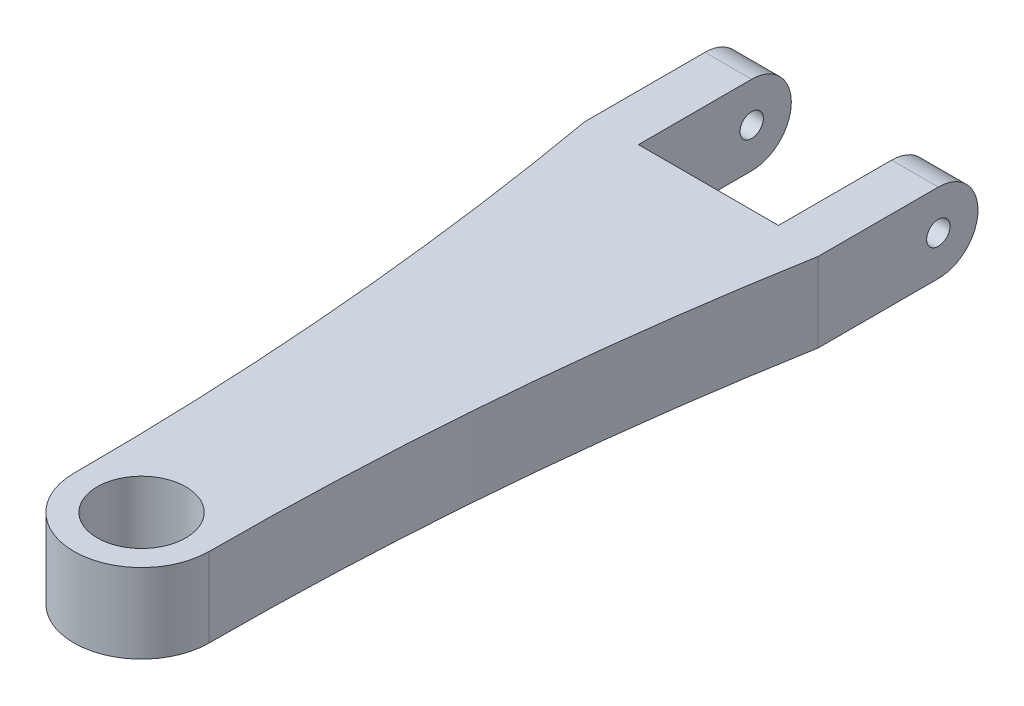
ISO-10303-21;
HEADER;
FILE_DESCRIPTION(('STEP AP214'),'2;1');
FILE_NAME('part.step','',(''),(''),'','','');
FILE_SCHEMA(('AUTOMOTIVE_DESIGN { 1 0 10303 214 1 1 1 1 }'));
ENDSEC;
DATA;
#1=APPLICATION_CONTEXT('core data for automotive mechanical design processes');
#2=APPLICATION_PROTOCOL_DEFINITION('international standard','automotive_design',2000,#1);
#3=PRODUCT_CONTEXT('',#1,'mechanical');
#4=PRODUCT('Part','Part','',(#3));
#5=PRODUCT_RELATED_PRODUCT_CATEGORY('part','',(#4));
#6=PRODUCT_DEFINITION_FORMATION('','',#4);
#7=PRODUCT_DEFINITION_CONTEXT('part definition',#1,'design');
#8=PRODUCT_DEFINITION('design','',#6,#7);
#9=PRODUCT_DEFINITION_SHAPE('','',#8);
#10=(LENGTH_UNIT() NAMED_UNIT(*) SI_UNIT(.MILLI.,.METRE.));
#11=(NAMED_UNIT(*) PLANE_ANGLE_UNIT() SI_UNIT($,.RADIAN.));
#12=(NAMED_UNIT(*) SI_UNIT($,.STERADIAN.) SOLID_ANGLE_UNIT());
#13=UNCERTAINTY_MEASURE_WITH_UNIT(LENGTH_MEASURE(1.E-05),#10,'distance_accuracy_value','');
#14=(GEOMETRIC_REPRESENTATION_CONTEXT(3) GLOBAL_UNCERTAINTY_ASSIGNED_CONTEXT((#13)) GLOBAL_UNIT_ASSIGNED_CONTEXT((#10,
#11,#12)) REPRESENTATION_CONTEXT('',''));
#15=CARTESIAN_POINT('',(0.,0.,0.));
#16=DIRECTION('',(0.,0.,1.));
#17=DIRECTION('',(1.,0.,0.));
#18=AXIS2_PLACEMENT_3D('',#15,#16,#17);
#19=CARTESIAN_POINT('',(-19.05,1.31634899059417E-13,-203.2));
#20=DIRECTION('',(-1.,0.,0.));
#21=DIRECTION('',(0.,-1.,0.));
#22=AXIS2_PLACEMENT_3D('',#19,#20,#21);
#23=PLANE('',#22);
#24=CARTESIAN_POINT('',(-19.05,0.,-185.094440122762));
#25=DIRECTION('',(-1.,0.,0.));
#26=DIRECTION('',(0.,-1.,0.));
#27=AXIS2_PLACEMENT_3D('',#24,#25,#26);
#28=CIRCLE('',#27,3.175);
#29=CARTESIAN_POINT('',(-19.05,-3.175,-185.094440122762));
#30=VERTEX_POINT('',#29);
#31=EDGE_CURVE('E144',#30,#30,#28,.T.);
#32=ORIENTED_EDGE('',*,*,#31,.T.);
#33=EDGE_LOOP('',(#32));
#34=FACE_BOUND('',#33,.T.);
#35=CARTESIAN_POINT('',(-19.05,0.,-185.094440122762));
#36=DIRECTION('',(-1.,0.,0.));
#37=DIRECTION('',(0.,-1.,0.));
#38=AXIS2_PLACEMENT_3D('',#35,#36,#37);
#39=CIRCLE('',#38,10.795);
#40=CARTESIAN_POINT('',(-19.0499999999999,10.795,-185.094440122762));
#41=VERTEX_POINT('',#40);
#42=CARTESIAN_POINT('',(-19.0500000000001,-10.795,-185.094440122762));
#43=VERTEX_POINT('',#42);
#44=EDGE_CURVE('E230',#41,#43,#39,.T.);
#45=ORIENTED_EDGE('',*,*,#44,.F.);
#46=DIRECTION('',(0.,0.,1.));
#47=VECTOR('',#46,1.);
#48=CARTESIAN_POINT('',(-19.05,10.795,-203.2));
#49=LINE('',#48,#47);
#50=CARTESIAN_POINT('',(-19.05,10.795,-154.288880245525));
#51=VERTEX_POINT('',#50);
#52=EDGE_CURVE('E159',#41,#51,#49,.T.);
#53=ORIENTED_EDGE('',*,*,#52,.T.);
#54=DIRECTION('',(0.,0.996194698091746,-0.0871557427476516));
#55=VECTOR('',#54,1.);
#56=CARTESIAN_POINT('',(-19.05,-10.795,-152.4));
#57=LINE('',#56,#55);
#58=CARTESIAN_POINT('',(-19.0500000000001,-10.795,-152.4));
#59=VERTEX_POINT('',#58);
#60=EDGE_CURVE('E204',#59,#51,#57,.T.);
#61=ORIENTED_EDGE('',*,*,#60,.F.);
#62=DIRECTION('',(0.,0.,1.));
#63=VECTOR('',#62,1.);
#64=CARTESIAN_POINT('',(-19.0500000000001,-10.795,-203.2));
#65=LINE('',#64,#63);
#66=EDGE_CURVE('E156',#43,#59,#65,.T.);
#67=ORIENTED_EDGE('',*,*,#66,.F.);
#68=EDGE_LOOP('',(#45,#53,#61,#67));
#69=FACE_BOUND('',#68,.T.);
#70=ADVANCED_FACE('F38',(#34,#69),#23,.F.);
#71=CARTESIAN_POINT('',(-31.75,0.,-203.2));
#72=DIRECTION('',(1.,0.,0.));
#73=DIRECTION('',(0.,0.,-1.));
#74=AXIS2_PLACEMENT_3D('',#71,#72,#73);
#75=PLANE('',#74);
#76=CARTESIAN_POINT('',(-31.75,0.,-185.094440122762));
#77=DIRECTION('',(1.,0.,0.));
#78=DIRECTION('',(0.,0.,-1.));
#79=AXIS2_PLACEMENT_3D('',#76,#77,#78);
#80=CIRCLE('',#79,3.175);
#81=CARTESIAN_POINT('',(-31.75,0.,-188.269440122762));
#82=VERTEX_POINT('',#81);
#83=EDGE_CURVE('E238',#82,#82,#80,.T.);
#84=ORIENTED_EDGE('',*,*,#83,.T.);
#85=EDGE_LOOP('',(#84));
#86=FACE_BOUND('',#85,.T.);
#87=CARTESIAN_POINT('',(-31.75,0.,-185.094440122762));
#88=DIRECTION('',(1.,0.,0.));
#89=DIRECTION('',(0.,0.,-1.));
#90=AXIS2_PLACEMENT_3D('',#87,#88,#89);
#91=CIRCLE('',#90,10.795);
#92=CARTESIAN_POINT('',(-31.75,-10.795,-185.094440122762));
#93=VERTEX_POINT('',#92);
#94=CARTESIAN_POINT('',(-31.75,10.795,-185.094440122762));
#95=VERTEX_POINT('',#94);
#96=EDGE_CURVE('E108',#93,#95,#91,.T.);
#97=ORIENTED_EDGE('',*,*,#96,.F.);
#98=DIRECTION('',(0.,0.,1.));
#99=VECTOR('',#98,1.);
#100=CARTESIAN_POINT('',(-31.75,-10.795,-203.2));
#101=LINE('',#100,#99);
#102=CARTESIAN_POINT('',(-31.75,-10.795,-152.4));
#103=VERTEX_POINT('',#102);
#104=EDGE_CURVE('E153',#93,#103,#101,.T.);
#105=ORIENTED_EDGE('',*,*,#104,.T.);
#106=DIRECTION('',(0.,-1.,0.));
#107=VECTOR('',#106,1.);
#108=CARTESIAN_POINT('',(-31.75,10.795,-152.4));
#109=LINE('',#108,#107);
#110=CARTESIAN_POINT('',(-31.75,10.795,-152.4));
#111=VERTEX_POINT('',#110);
#112=EDGE_CURVE('E165',#111,#103,#109,.T.);
#113=ORIENTED_EDGE('',*,*,#112,.F.);
#114=DIRECTION('',(0.,0.,1.));
#115=VECTOR('',#114,1.);
#116=CARTESIAN_POINT('',(-31.75,10.795,-203.2));
#117=LINE('',#116,#115);
#118=EDGE_CURVE('E150',#95,#111,#117,.T.);
#119=ORIENTED_EDGE('',*,*,#118,.F.);
#120=EDGE_LOOP('',(#97,#105,#113,#119));
#121=FACE_BOUND('',#120,.T.);
#122=ADVANCED_FACE('F270',(#86,#121),#75,.F.);
#123=CARTESIAN_POINT('',(19.05,0.,-203.2));
#124=DIRECTION('',(-1.,0.,0.));
#125=DIRECTION('',(0.,-1.,0.));
#126=AXIS2_PLACEMENT_3D('',#123,#124,#125);
#127=PLANE('',#126);
#128=CARTESIAN_POINT('',(19.05,0.,-185.094440122762));
#129=DIRECTION('',(-1.,0.,0.));
#130=DIRECTION('',(0.,-1.,0.));
#131=AXIS2_PLACEMENT_3D('',#128,#129,#130);
#132=CIRCLE('',#131,3.175);
#133=CARTESIAN_POINT('',(19.05,-3.175,-185.094440122762));
#134=VERTEX_POINT('',#133);
#135=EDGE_CURVE('E247',#134,#134,#132,.T.);
#136=ORIENTED_EDGE('',*,*,#135,.F.);
#137=EDGE_LOOP('',(#136));
#138=FACE_BOUND('',#137,.T.);
#139=DIRECTION('',(0.,0.,1.));
#140=VECTOR('',#139,1.);
#141=CARTESIAN_POINT('',(19.05,10.795,-203.2));
#142=LINE('',#141,#140);
#143=CARTESIAN_POINT('',(19.05,10.795,-185.094440122762));
#144=VERTEX_POINT('',#143);
#145=CARTESIAN_POINT('',(19.05,10.795,-154.288880245525));
#146=VERTEX_POINT('',#145);
#147=EDGE_CURVE('E142',#144,#146,#142,.T.);
#148=ORIENTED_EDGE('',*,*,#147,.F.);
#149=CARTESIAN_POINT('',(19.05,0.,-185.094440122762));
#150=DIRECTION('',(-1.,0.,0.));
#151=DIRECTION('',(0.,-1.,0.));
#152=AXIS2_PLACEMENT_3D('',#149,#150,#151);
#153=CIRCLE('',#152,10.795);
#154=CARTESIAN_POINT('',(19.05,-10.795,-185.094440122762));
#155=VERTEX_POINT('',#154);
#156=EDGE_CURVE('E233',#144,#155,#153,.T.);
#157=ORIENTED_EDGE('',*,*,#156,.T.);
#158=DIRECTION('',(0.,0.,1.));
#159=VECTOR('',#158,1.);
#160=CARTESIAN_POINT('',(19.05,-10.795,-203.2));
#161=LINE('',#160,#159);
#162=CARTESIAN_POINT('',(19.05,-10.795,-152.4));
#163=VERTEX_POINT('',#162);
#164=EDGE_CURVE('E130',#155,#163,#161,.T.);
#165=ORIENTED_EDGE('',*,*,#164,.T.);
#166=DIRECTION('',(0.,-0.996194698091746,0.0871557427476516));
#167=VECTOR('',#166,1.);
#168=CARTESIAN_POINT('',(19.05,-10.795,-152.4));
#169=LINE('',#168,#167);
#170=EDGE_CURVE('E48',#146,#163,#169,.T.);
#171=ORIENTED_EDGE('',*,*,#170,.F.);
#172=EDGE_LOOP('',(#148,#157,#165,#171));
#173=FACE_BOUND('',#172,.T.);
#174=ADVANCED_FACE('F228',(#138,#173),#127,.T.);
#175=CARTESIAN_POINT('',(31.75,0.,-203.2));
#176=DIRECTION('',(-1.,0.,0.));
#177=DIRECTION('',(0.,0.,1.));
#178=AXIS2_PLACEMENT_3D('',#175,#176,#177);
#179=PLANE('',#178);
#180=CARTESIAN_POINT('',(31.75,0.,-185.094440122762));
#181=DIRECTION('',(1.,0.,0.));
#182=DIRECTION('',(0.,0.,-1.));
#183=AXIS2_PLACEMENT_3D('',#180,#181,#182);
#184=CIRCLE('',#183,3.175);
#185=CARTESIAN_POINT('',(31.75,0.,-188.269440122762));
#186=VERTEX_POINT('',#185);
#187=EDGE_CURVE('E232',#186,#186,#184,.T.);
#188=ORIENTED_EDGE('',*,*,#187,.F.);
#189=EDGE_LOOP('',(#188));
#190=FACE_BOUND('',#189,.T.);
#191=CARTESIAN_POINT('',(31.75,0.,-185.094440122762));
#192=DIRECTION('',(1.,0.,0.));
#193=DIRECTION('',(0.,0.,-1.));
#194=AXIS2_PLACEMENT_3D('',#191,#192,#193);
#195=CIRCLE('',#194,10.795);
#196=CARTESIAN_POINT('',(31.75,10.795,-185.094440122762));
#197=VERTEX_POINT('',#196);
#198=CARTESIAN_POINT('',(31.75,-10.795,-185.094440122762));
#199=VERTEX_POINT('',#198);
#200=EDGE_CURVE('E11',#197,#199,#195,.F.);
#201=ORIENTED_EDGE('',*,*,#200,.F.);
#202=DIRECTION('',(0.,0.,1.));
#203=VECTOR('',#202,1.);
#204=CARTESIAN_POINT('',(31.75,10.795,-203.2));
#205=LINE('',#204,#203);
#206=CARTESIAN_POINT('',(31.75,10.795,-152.4));
#207=VERTEX_POINT('',#206);
#208=EDGE_CURVE('E138',#197,#207,#205,.T.);
#209=ORIENTED_EDGE('',*,*,#208,.T.);
#210=DIRECTION('',(0.,-1.,0.));
#211=VECTOR('',#210,1.);
#212=CARTESIAN_POINT('',(31.75,10.795,-152.4));
#213=LINE('',#212,#211);
#214=CARTESIAN_POINT('',(31.75,-10.795,-152.4));
#215=VERTEX_POINT('',#214);
#216=EDGE_CURVE('E135',#207,#215,#213,.T.);
#217=ORIENTED_EDGE('',*,*,#216,.T.);
#218=DIRECTION('',(0.,0.,1.));
#219=VECTOR('',#218,1.);
#220=CARTESIAN_POINT('',(31.75,-10.795,-203.2));
#221=LINE('',#220,#219);
#222=EDGE_CURVE('E127',#199,#215,#221,.T.);
#223=ORIENTED_EDGE('',*,*,#222,.F.);
#224=EDGE_LOOP('',(#201,#209,#217,#223));
#225=FACE_BOUND('',#224,.T.);
#226=ADVANCED_FACE('F133',(#190,#225),#179,.F.);
#227=CARTESIAN_POINT('',(895.939642857131,10.795,-1.02001740387436E-12));
#228=DIRECTION('',(0.,1.,0.));
#229=DIRECTION('',(0.,0.,1.));
#230=AXIS2_PLACEMENT_3D('',#227,#228,#229);
#231=PLANE('',#230);
#232=DIRECTION('',(1.,0.,0.));
#233=VECTOR('',#232,1.);
#234=CARTESIAN_POINT('',(-31.75,10.795,-185.094440122762));
#235=LINE('',#234,#233);
#236=EDGE_CURVE('E240',#95,#41,#235,.T.);
#237=ORIENTED_EDGE('',*,*,#236,.F.);
#238=ORIENTED_EDGE('',*,*,#118,.T.);
#239=CARTESIAN_POINT('',(-895.939642857131,10.795,-1.02001740387436E-12));
#240=DIRECTION('',(0.,-1.,0.));
#241=DIRECTION('',(0.,0.,-1.));
#242=AXIS2_PLACEMENT_3D('',#239,#240,#241);
#243=CIRCLE('',#242,877.524642857131);
#244=CARTESIAN_POINT('',(-18.415,10.795,0.));
#245=VERTEX_POINT('',#244);
#246=EDGE_CURVE('E164',#111,#245,#243,.T.);
#247=ORIENTED_EDGE('',*,*,#246,.T.);
#248=CARTESIAN_POINT('',(0.,10.795,0.));
#249=DIRECTION('',(0.,1.,0.));
#250=DIRECTION('',(0.,0.,1.));
#251=AXIS2_PLACEMENT_3D('',#248,#249,#250);
#252=CIRCLE('',#251,18.415);
#253=CARTESIAN_POINT('',(18.415,10.795,0.));
#254=VERTEX_POINT('',#253);
#255=EDGE_CURVE('E188',#245,#254,#252,.T.);
#256=ORIENTED_EDGE('',*,*,#255,.T.);
#257=CARTESIAN_POINT('',(895.939642857131,10.795,-1.02001740387436E-12));
#258=DIRECTION('',(0.,-1.,0.));
#259=DIRECTION('',(0.,0.,1.));
#260=AXIS2_PLACEMENT_3D('',#257,#258,#259);
#261=CIRCLE('',#260,877.524642857131);
#262=EDGE_CURVE('E191',#254,#207,#261,.T.);
#263=ORIENTED_EDGE('',*,*,#262,.T.);
#264=ORIENTED_EDGE('',*,*,#208,.F.);
#265=EDGE_CURVE('E117',#144,#197,#235,.T.);
#266=ORIENTED_EDGE('',*,*,#265,.F.);
#267=ORIENTED_EDGE('',*,*,#147,.T.);
#268=DIRECTION('',(1.,0.,0.));
#269=VECTOR('',#268,1.);
#270=CARTESIAN_POINT('',(-31.751,10.795,-154.288880245525));
#271=LINE('',#270,#269);
#272=EDGE_CURVE('E205',#51,#146,#271,.T.);
#273=ORIENTED_EDGE('',*,*,#272,.F.);
#274=ORIENTED_EDGE('',*,*,#52,.F.);
#275=EDGE_LOOP('',(#237,#238,#247,#256,#263,#264,#266,#267,#273,#274));
#276=FACE_BOUND('',#275,.T.);
#277=CARTESIAN_POINT('',(0.,10.795,0.));
#278=DIRECTION('',(0.,1.,0.));
#279=DIRECTION('',(0.,0.,1.));
#280=AXIS2_PLACEMENT_3D('',#277,#278,#279);
#281=CIRCLE('',#280,12.065);
#282=CARTESIAN_POINT('',(0.,10.795,12.065));
#283=VERTEX_POINT('',#282);
#284=EDGE_CURVE('E175',#283,#283,#281,.T.);
#285=ORIENTED_EDGE('',*,*,#284,.F.);
#286=EDGE_LOOP('',(#285));
#287=FACE_BOUND('',#286,.T.);
#288=ADVANCED_FACE('F223',(#276,#287),#231,.T.);
#289=CARTESIAN_POINT('',(895.939642857131,-10.795,-1.02001740387436E-12));
#290=DIRECTION('',(0.,1.,0.));
#291=DIRECTION('',(0.,0.,1.));
#292=AXIS2_PLACEMENT_3D('',#289,#290,#291);
#293=PLANE('',#292);
#294=ORIENTED_EDGE('',*,*,#104,.F.);
#295=DIRECTION('',(1.,0.,0.));
#296=VECTOR('',#295,1.);
#297=CARTESIAN_POINT('',(-31.75,-10.795,-185.094440122762));
#298=LINE('',#297,#296);
#299=EDGE_CURVE('E56',#93,#43,#298,.T.);
#300=ORIENTED_EDGE('',*,*,#299,.T.);
#301=ORIENTED_EDGE('',*,*,#66,.T.);
#302=DIRECTION('',(1.,0.,0.));
#303=VECTOR('',#302,1.);
#304=CARTESIAN_POINT('',(-31.751,-10.795,-152.4));
#305=LINE('',#304,#303);
#306=EDGE_CURVE('E197',#59,#163,#305,.T.);
#307=ORIENTED_EDGE('',*,*,#306,.T.);
#308=ORIENTED_EDGE('',*,*,#164,.F.);
#309=EDGE_CURVE('E114',#155,#199,#298,.T.);
#310=ORIENTED_EDGE('',*,*,#309,.T.);
#311=ORIENTED_EDGE('',*,*,#222,.T.);
#312=CARTESIAN_POINT('',(895.939642857131,-10.795,-1.02001740387436E-12));
#313=DIRECTION('',(0.,-1.,0.));
#314=DIRECTION('',(0.,0.,1.));
#315=AXIS2_PLACEMENT_3D('',#312,#313,#314);
#316=CIRCLE('',#315,877.524642857131);
#317=CARTESIAN_POINT('',(18.415,-10.795,0.));
#318=VERTEX_POINT('',#317);
#319=EDGE_CURVE('E180',#318,#215,#316,.T.);
#320=ORIENTED_EDGE('',*,*,#319,.F.);
#321=CARTESIAN_POINT('',(0.,-10.795,0.));
#322=DIRECTION('',(0.,1.,0.));
#323=DIRECTION('',(0.,0.,1.));
#324=AXIS2_PLACEMENT_3D('',#321,#322,#323);
#325=CIRCLE('',#324,18.415);
#326=CARTESIAN_POINT('',(-18.415,-10.795,0.));
#327=VERTEX_POINT('',#326);
#328=EDGE_CURVE('E169',#327,#318,#325,.T.);
#329=ORIENTED_EDGE('',*,*,#328,.F.);
#330=CARTESIAN_POINT('',(-895.939642857131,-10.795,-1.02001740387436E-12));
#331=DIRECTION('',(0.,-1.,0.));
#332=DIRECTION('',(0.,0.,-1.));
#333=AXIS2_PLACEMENT_3D('',#330,#331,#332);
#334=CIRCLE('',#333,877.524642857131);
#335=EDGE_CURVE('E170',#103,#327,#334,.T.);
#336=ORIENTED_EDGE('',*,*,#335,.F.);
#337=EDGE_LOOP('',(#294,#300,#301,#307,#308,#310,#311,#320,#329,#336));
#338=FACE_BOUND('',#337,.T.);
#339=CARTESIAN_POINT('',(0.,-10.795,0.));
#340=DIRECTION('',(0.,1.,0.));
#341=DIRECTION('',(0.,0.,1.));
#342=AXIS2_PLACEMENT_3D('',#339,#340,#341);
#343=CIRCLE('',#342,12.065);
#344=CARTESIAN_POINT('',(0.,-10.795,12.065));
#345=VERTEX_POINT('',#344);
#346=EDGE_CURVE('E187',#345,#345,#343,.T.);
#347=ORIENTED_EDGE('',*,*,#346,.T.);
#348=EDGE_LOOP('',(#347));
#349=FACE_BOUND('',#348,.T.);
#350=ADVANCED_FACE('F124',(#338,#349),#293,.F.);
#351=CARTESIAN_POINT('',(895.939642857131,10.795,-1.02001740387436E-12));
#352=DIRECTION('',(0.,-1.,0.));
#353=DIRECTION('',(0.,0.,-1.));
#354=AXIS2_PLACEMENT_3D('',#351,#352,#353);
#355=CYLINDRICAL_SURFACE('',#354,877.524642857131);
#356=ORIENTED_EDGE('',*,*,#319,.T.);
#357=ORIENTED_EDGE('',*,*,#216,.F.);
#358=ORIENTED_EDGE('',*,*,#262,.F.);
#359=DIRECTION('',(0.,-1.,0.));
#360=VECTOR('',#359,1.);
#361=CARTESIAN_POINT('',(18.415,10.795,0.));
#362=LINE('',#361,#360);
#363=EDGE_CURVE('E176',#254,#318,#362,.T.);
#364=ORIENTED_EDGE('',*,*,#363,.T.);
#365=EDGE_LOOP('',(#356,#357,#358,#364));
#366=FACE_BOUND('',#365,.T.);
#367=ADVANCED_FACE('F279',(#366),#355,.F.);
#368=CARTESIAN_POINT('',(-895.939642857131,10.795,-1.02001740387436E-12));
#369=DIRECTION('',(0.,-1.,0.));
#370=DIRECTION('',(0.,0.,-1.));
#371=AXIS2_PLACEMENT_3D('',#368,#369,#370);
#372=CYLINDRICAL_SURFACE('',#371,877.524642857131);
#373=ORIENTED_EDGE('',*,*,#335,.T.);
#374=DIRECTION('',(0.,-1.,0.));
#375=VECTOR('',#374,1.);
#376=CARTESIAN_POINT('',(-18.415,10.795,0.));
#377=LINE('',#376,#375);
#378=EDGE_CURVE('E171',#245,#327,#377,.T.);
#379=ORIENTED_EDGE('',*,*,#378,.F.);
#380=ORIENTED_EDGE('',*,*,#246,.F.);
#381=ORIENTED_EDGE('',*,*,#112,.T.);
#382=EDGE_LOOP('',(#373,#379,#380,#381));
#383=FACE_BOUND('',#382,.T.);
#384=ADVANCED_FACE('F282',(#383),#372,.F.);
#385=CARTESIAN_POINT('',(0.,10.795,0.));
#386=DIRECTION('',(0.,-1.,0.));
#387=DIRECTION('',(0.,0.,-1.));
#388=AXIS2_PLACEMENT_3D('',#385,#386,#387);
#389=CYLINDRICAL_SURFACE('',#388,18.415);
#390=ORIENTED_EDGE('',*,*,#328,.T.);
#391=ORIENTED_EDGE('',*,*,#363,.F.);
#392=ORIENTED_EDGE('',*,*,#255,.F.);
#393=ORIENTED_EDGE('',*,*,#378,.T.);
#394=EDGE_LOOP('',(#390,#391,#392,#393));
#395=FACE_BOUND('',#394,.T.);
#396=ADVANCED_FACE('F286',(#395),#389,.T.);
#397=CARTESIAN_POINT('',(0.,10.795,0.));
#398=DIRECTION('',(0.,-1.,0.));
#399=DIRECTION('',(0.,0.,-1.));
#400=AXIS2_PLACEMENT_3D('',#397,#398,#399);
#401=CYLINDRICAL_SURFACE('',#400,12.065);
#402=ORIENTED_EDGE('',*,*,#284,.T.);
#403=EDGE_LOOP('',(#402));
#404=FACE_BOUND('',#403,.T.);
#405=ORIENTED_EDGE('',*,*,#346,.F.);
#406=EDGE_LOOP('',(#405));
#407=FACE_BOUND('',#406,.T.);
#408=ADVANCED_FACE('F290',(#404,#407),#401,.F.);
#409=CARTESIAN_POINT('',(-31.751,-10.795,-152.4));
#410=DIRECTION('',(0.,0.0871557427476516,0.996194698091746));
#411=DIRECTION('',(0.,-0.996194698091746,0.0871557427476516));
#412=AXIS2_PLACEMENT_3D('',#409,#410,#411);
#413=PLANE('',#412);
#414=ORIENTED_EDGE('',*,*,#60,.T.);
#415=ORIENTED_EDGE('',*,*,#272,.T.);
#416=ORIENTED_EDGE('',*,*,#170,.T.);
#417=ORIENTED_EDGE('',*,*,#306,.F.);
#418=EDGE_LOOP('',(#414,#415,#416,#417));
#419=FACE_BOUND('',#418,.T.);
#420=ADVANCED_FACE('F40',(#419),#413,.F.);
#421=CARTESIAN_POINT('',(-31.75,0.,-185.094440122762));
#422=DIRECTION('',(1.,0.,0.));
#423=DIRECTION('',(0.,0.,-1.));
#424=AXIS2_PLACEMENT_3D('',#421,#422,#423);
#425=CYLINDRICAL_SURFACE('',#424,3.175);
#426=ORIENTED_EDGE('',*,*,#135,.T.);
#427=EDGE_LOOP('',(#426));
#428=FACE_BOUND('',#427,.T.);
#429=ORIENTED_EDGE('',*,*,#187,.T.);
#430=EDGE_LOOP('',(#429));
#431=FACE_BOUND('',#430,.T.);
#432=ADVANCED_FACE('F257',(#428,#431),#425,.F.);
#433=ORIENTED_EDGE('',*,*,#83,.F.);
#434=EDGE_LOOP('',(#433));
#435=FACE_BOUND('',#434,.T.);
#436=ORIENTED_EDGE('',*,*,#31,.F.);
#437=EDGE_LOOP('',(#436));
#438=FACE_BOUND('',#437,.T.);
#439=ADVANCED_FACE('F255',(#435,#438),#425,.F.);
#440=CARTESIAN_POINT('',(-31.75,0.,-185.094440122762));
#441=DIRECTION('',(1.,0.,0.));
#442=DIRECTION('',(0.,0.,-1.));
#443=AXIS2_PLACEMENT_3D('',#440,#441,#442);
#444=CYLINDRICAL_SURFACE('',#443,10.795);
#445=ORIENTED_EDGE('',*,*,#265,.T.);
#446=ORIENTED_EDGE('',*,*,#200,.T.);
#447=ORIENTED_EDGE('',*,*,#309,.F.);
#448=ORIENTED_EDGE('',*,*,#156,.F.);
#449=EDGE_LOOP('',(#445,#446,#447,#448));
#450=FACE_BOUND('',#449,.T.);
#451=ADVANCED_FACE('F113',(#450),#444,.T.);
#452=ORIENTED_EDGE('',*,*,#44,.T.);
#453=ORIENTED_EDGE('',*,*,#299,.F.);
#454=ORIENTED_EDGE('',*,*,#96,.T.);
#455=ORIENTED_EDGE('',*,*,#236,.T.);
#456=EDGE_LOOP('',(#452,#453,#454,#455));
#457=FACE_BOUND('',#456,.T.);
#458=ADVANCED_FACE('F264',(#457),#444,.T.);
#459=CLOSED_SHELL('',(#70,#122,#174,#226,#288,#350,#367,#384,#396,#408,#420,#432,#439,#451,#458));
#460=MANIFOLD_SOLID_BREP('B2',#459);
#461=ADVANCED_BREP_SHAPE_REPRESENTATION('',(#18,#460),#14);
#462=SHAPE_DEFINITION_REPRESENTATION(#9,#461);
ENDSEC;
END-ISO-10303-21;
